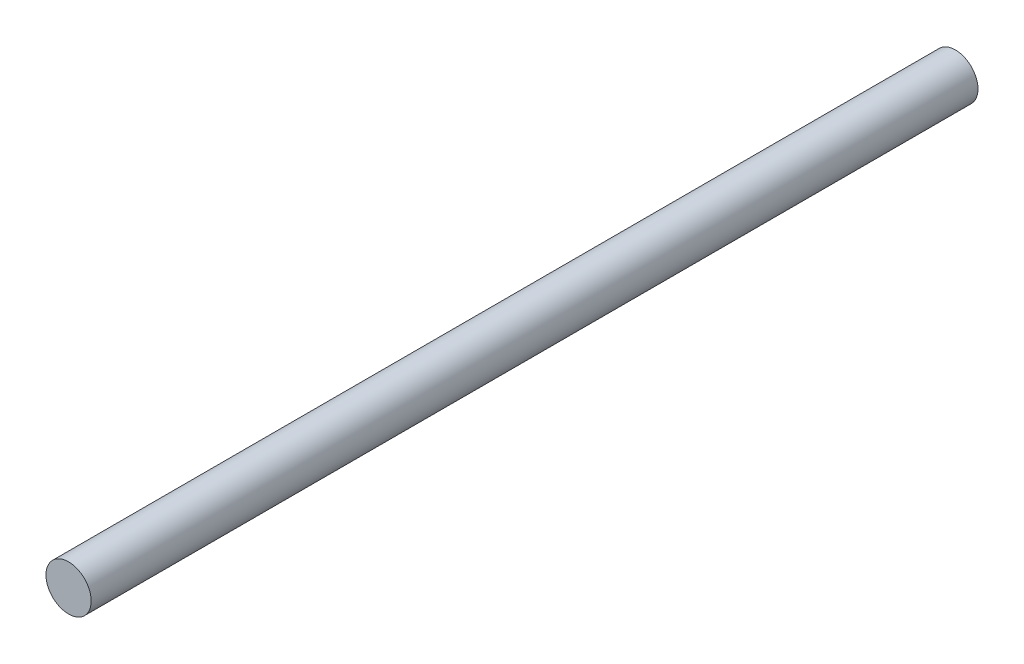
ISO-10303-21;
HEADER;
FILE_DESCRIPTION(('STEP AP214'),'2;1');
FILE_NAME('part.step','',(''),(''),'','','');
FILE_SCHEMA(('AUTOMOTIVE_DESIGN { 1 0 10303 214 1 1 1 1 }'));
ENDSEC;
DATA;
#1=APPLICATION_CONTEXT('core data for automotive mechanical design processes');
#2=APPLICATION_PROTOCOL_DEFINITION('international standard','automotive_design',2000,#1);
#3=PRODUCT_CONTEXT('',#1,'mechanical');
#4=PRODUCT('Part','Part','',(#3));
#5=PRODUCT_RELATED_PRODUCT_CATEGORY('part','',(#4));
#6=PRODUCT_DEFINITION_FORMATION('','',#4);
#7=PRODUCT_DEFINITION_CONTEXT('part definition',#1,'design');
#8=PRODUCT_DEFINITION('design','',#6,#7);
#9=PRODUCT_DEFINITION_SHAPE('','',#8);
#10=(LENGTH_UNIT() NAMED_UNIT(*) SI_UNIT(.MILLI.,.METRE.));
#11=(NAMED_UNIT(*) PLANE_ANGLE_UNIT() SI_UNIT($,.RADIAN.));
#12=(NAMED_UNIT(*) SI_UNIT($,.STERADIAN.) SOLID_ANGLE_UNIT());
#13=UNCERTAINTY_MEASURE_WITH_UNIT(LENGTH_MEASURE(1.E-05),#10,'distance_accuracy_value','');
#14=(GEOMETRIC_REPRESENTATION_CONTEXT(3) GLOBAL_UNCERTAINTY_ASSIGNED_CONTEXT((#13)) GLOBAL_UNIT_ASSIGNED_CONTEXT((#10,
#11,#12)) REPRESENTATION_CONTEXT('',''));
#15=CARTESIAN_POINT('',(0.,0.,0.));
#16=DIRECTION('',(0.,0.,1.));
#17=DIRECTION('',(1.,0.,0.));
#18=AXIS2_PLACEMENT_3D('',#15,#16,#17);
#19=CARTESIAN_POINT('',(0.,0.,124.46));
#20=DIRECTION('',(0.,0.,-1.));
#21=DIRECTION('',(-1.,0.,0.));
#22=AXIS2_PLACEMENT_3D('',#19,#20,#21);
#23=CYLINDRICAL_SURFACE('',#22,3.175);
#24=CARTESIAN_POINT('',(0.,0.,124.46));
#25=DIRECTION('',(0.,0.,1.));
#26=DIRECTION('',(1.,0.,0.));
#27=AXIS2_PLACEMENT_3D('',#24,#25,#26);
#28=CIRCLE('',#27,3.175);
#29=CARTESIAN_POINT('',(3.175,0.,124.46));
#30=VERTEX_POINT('',#29);
#31=EDGE_CURVE('E10',#30,#30,#28,.T.);
#32=ORIENTED_EDGE('',*,*,#31,.F.);
#33=EDGE_LOOP('',(#32));
#34=FACE_BOUND('',#33,.T.);
#35=CARTESIAN_POINT('',(0.,0.,0.));
#36=DIRECTION('',(0.,0.,1.));
#37=DIRECTION('',(1.,0.,0.));
#38=AXIS2_PLACEMENT_3D('',#35,#36,#37);
#39=CIRCLE('',#38,3.175);
#40=CARTESIAN_POINT('',(3.175,0.,0.));
#41=VERTEX_POINT('',#40);
#42=EDGE_CURVE('E34',#41,#41,#39,.T.);
#43=ORIENTED_EDGE('',*,*,#42,.T.);
#44=EDGE_LOOP('',(#43));
#45=FACE_BOUND('',#44,.T.);
#46=ADVANCED_FACE('F31',(#34,#45),#23,.T.);
#47=CARTESIAN_POINT('',(0.,0.,124.46));
#48=DIRECTION('',(0.,0.,1.));
#49=DIRECTION('',(1.,0.,0.));
#50=AXIS2_PLACEMENT_3D('',#47,#48,#49);
#51=PLANE('',#50);
#52=ORIENTED_EDGE('',*,*,#31,.T.);
#53=EDGE_LOOP('',(#52));
#54=FACE_BOUND('',#53,.T.);
#55=ADVANCED_FACE('F46',(#54),#51,.T.);
#56=CARTESIAN_POINT('',(0.,0.,0.));
#57=DIRECTION('',(0.,0.,1.));
#58=DIRECTION('',(1.,0.,0.));
#59=AXIS2_PLACEMENT_3D('',#56,#57,#58);
#60=PLANE('',#59);
#61=ORIENTED_EDGE('',*,*,#42,.F.);
#62=EDGE_LOOP('',(#61));
#63=FACE_BOUND('',#62,.T.);
#64=ADVANCED_FACE('F44',(#63),#60,.F.);
#65=CLOSED_SHELL('',(#46,#55,#64));
#66=MANIFOLD_SOLID_BREP('B2',#65);
#67=ADVANCED_BREP_SHAPE_REPRESENTATION('',(#18,#66),#14);
#68=SHAPE_DEFINITION_REPRESENTATION(#9,#67);
ENDSEC;
END-ISO-10303-21;
